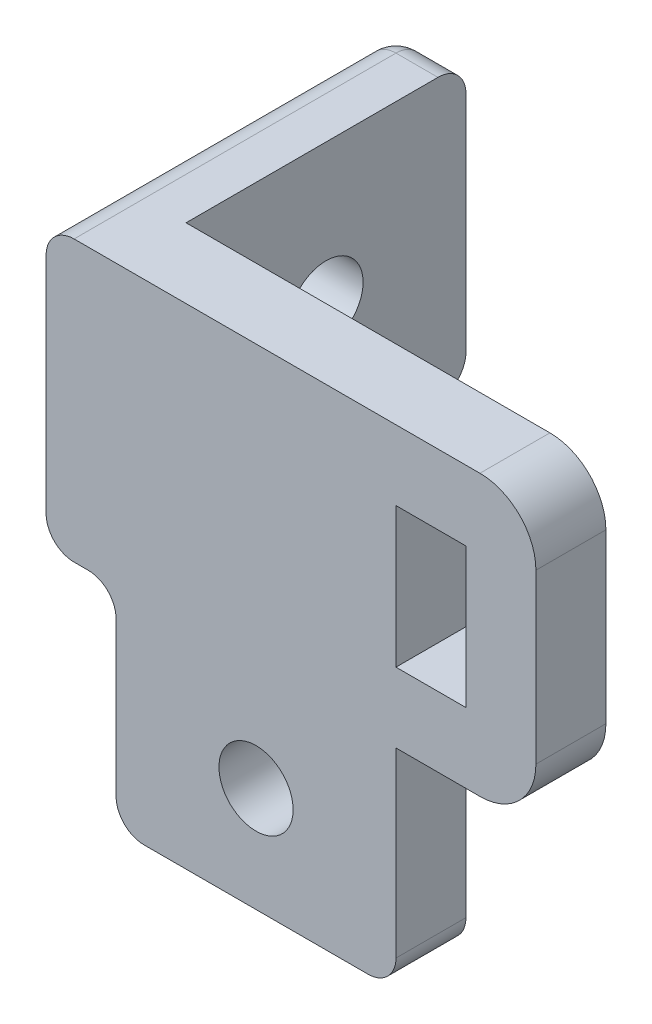
ISO-10303-21;
HEADER;
FILE_DESCRIPTION(('STEP AP214'),'2;1');
FILE_NAME('part.step','',(''),(''),'','','');
FILE_SCHEMA(('AUTOMOTIVE_DESIGN { 1 0 10303 214 1 1 1 1 }'));
ENDSEC;
DATA;
#1=APPLICATION_CONTEXT('core data for automotive mechanical design processes');
#2=APPLICATION_PROTOCOL_DEFINITION('international standard','automotive_design',2000,#1);
#3=PRODUCT_CONTEXT('',#1,'mechanical');
#4=PRODUCT('Part','Part','',(#3));
#5=PRODUCT_RELATED_PRODUCT_CATEGORY('part','',(#4));
#6=PRODUCT_DEFINITION_FORMATION('','',#4);
#7=PRODUCT_DEFINITION_CONTEXT('part definition',#1,'design');
#8=PRODUCT_DEFINITION('design','',#6,#7);
#9=PRODUCT_DEFINITION_SHAPE('','',#8);
#10=(LENGTH_UNIT() NAMED_UNIT(*) SI_UNIT(.MILLI.,.METRE.));
#11=(NAMED_UNIT(*) PLANE_ANGLE_UNIT() SI_UNIT($,.RADIAN.));
#12=(NAMED_UNIT(*) SI_UNIT($,.STERADIAN.) SOLID_ANGLE_UNIT());
#13=UNCERTAINTY_MEASURE_WITH_UNIT(LENGTH_MEASURE(1.E-05),#10,'distance_accuracy_value','');
#14=(GEOMETRIC_REPRESENTATION_CONTEXT(3) GLOBAL_UNCERTAINTY_ASSIGNED_CONTEXT((#13)) GLOBAL_UNIT_ASSIGNED_CONTEXT((#10,
#11,#12)) REPRESENTATION_CONTEXT('',''));
#15=CARTESIAN_POINT('',(0.,0.,0.));
#16=DIRECTION('',(0.,0.,1.));
#17=DIRECTION('',(1.,0.,0.));
#18=AXIS2_PLACEMENT_3D('',#15,#16,#17);
#19=CARTESIAN_POINT('',(-15.,-10.,5.));
#20=DIRECTION('',(0.,1.,0.));
#21=DIRECTION('',(0.,0.,1.));
#22=AXIS2_PLACEMENT_3D('',#19,#20,#21);
#23=PLANE('',#22);
#24=DIRECTION('',(1.,0.,0.));
#25=VECTOR('',#24,1.);
#26=CARTESIAN_POINT('',(-15.,-10.,5.));
#27=LINE('',#26,#25);
#28=CARTESIAN_POINT('',(4.99999999999999,-10.,5.));
#29=VERTEX_POINT('',#28);
#30=CARTESIAN_POINT('',(11.,-10.,5.));
#31=VERTEX_POINT('',#30);
#32=EDGE_CURVE('E256',#29,#31,#27,.T.);
#33=ORIENTED_EDGE('',*,*,#32,.F.);
#34=DIRECTION('',(0.,0.,1.));
#35=VECTOR('',#34,1.);
#36=CARTESIAN_POINT('',(5.,-10.,0.));
#37=LINE('',#36,#35);
#38=CARTESIAN_POINT('',(5.,-10.,0.));
#39=VERTEX_POINT('',#38);
#40=EDGE_CURVE('E233',#39,#29,#37,.T.);
#41=ORIENTED_EDGE('',*,*,#40,.F.);
#42=DIRECTION('',(1.,0.,0.));
#43=VECTOR('',#42,1.);
#44=CARTESIAN_POINT('',(-15.,-10.,0.));
#45=LINE('',#44,#43);
#46=CARTESIAN_POINT('',(11.,-10.,0.));
#47=VERTEX_POINT('',#46);
#48=EDGE_CURVE('E243',#39,#47,#45,.T.);
#49=ORIENTED_EDGE('',*,*,#48,.T.);
#50=DIRECTION('',(0.,0.,-1.));
#51=VECTOR('',#50,1.);
#52=CARTESIAN_POINT('',(11.,-10.,5.));
#53=LINE('',#52,#51);
#54=EDGE_CURVE('E367',#31,#47,#53,.T.);
#55=ORIENTED_EDGE('',*,*,#54,.F.);
#56=EDGE_LOOP('',(#33,#41,#49,#55));
#57=FACE_BOUND('',#56,.T.);
#58=ADVANCED_FACE('F70',(#57),#23,.F.);
#59=CARTESIAN_POINT('',(-18.,-10.,5.));
#60=VERTEX_POINT('',#59);
#61=CARTESIAN_POINT('',(-17.,-10.,5.));
#62=VERTEX_POINT('',#61);
#63=EDGE_CURVE('E348',#60,#62,#27,.T.);
#64=ORIENTED_EDGE('',*,*,#63,.F.);
#65=DIRECTION('',(0.,0.,1.));
#66=VECTOR('',#65,1.);
#67=CARTESIAN_POINT('',(-18.,-10.,-18.));
#68=LINE('',#67,#66);
#69=CARTESIAN_POINT('',(-18.,-10.,-18.));
#70=VERTEX_POINT('',#69);
#71=EDGE_CURVE('E455',#60,#70,#68,.F.);
#72=ORIENTED_EDGE('',*,*,#71,.T.);
#73=DIRECTION('',(1.,0.,0.));
#74=VECTOR('',#73,1.);
#75=CARTESIAN_POINT('',(-15.,-10.,-18.));
#76=LINE('',#75,#74);
#77=CARTESIAN_POINT('',(-15.,-10.,-18.));
#78=VERTEX_POINT('',#77);
#79=EDGE_CURVE('E436',#70,#78,#76,.T.);
#80=ORIENTED_EDGE('',*,*,#79,.T.);
#81=DIRECTION('',(0.,0.,1.));
#82=VECTOR('',#81,1.);
#83=CARTESIAN_POINT('',(-15.,-10.,-20.));
#84=LINE('',#83,#82);
#85=CARTESIAN_POINT('',(-15.,-10.,0.));
#86=VERTEX_POINT('',#85);
#87=EDGE_CURVE('E286',#78,#86,#84,.T.);
#88=ORIENTED_EDGE('',*,*,#87,.T.);
#89=DIRECTION('',(-1.,0.,0.));
#90=VECTOR('',#89,1.);
#91=CARTESIAN_POINT('',(11.,-10.,0.));
#92=LINE('',#91,#90);
#93=CARTESIAN_POINT('',(-17.,-10.,0.));
#94=VERTEX_POINT('',#93);
#95=EDGE_CURVE('E370',#86,#94,#92,.T.);
#96=ORIENTED_EDGE('',*,*,#95,.T.);
#97=DIRECTION('',(0.,0.,1.));
#98=VECTOR('',#97,1.);
#99=CARTESIAN_POINT('',(-17.,-10.,5.));
#100=LINE('',#99,#98);
#101=EDGE_CURVE('E383',#94,#62,#100,.T.);
#102=ORIENTED_EDGE('',*,*,#101,.T.);
#103=EDGE_LOOP('',(#64,#72,#80,#88,#96,#102));
#104=FACE_BOUND('',#103,.T.);
#105=ADVANCED_FACE('F530',(#104),#23,.F.);
#106=CARTESIAN_POINT('',(11.,-6.,5.));
#107=DIRECTION('',(0.,0.,-1.));
#108=DIRECTION('',(-1.,0.,0.));
#109=AXIS2_PLACEMENT_3D('',#106,#107,#108);
#110=CYLINDRICAL_SURFACE('',#109,4.);
#111=CARTESIAN_POINT('',(11.,-6.,0.));
#112=DIRECTION('',(0.,0.,-1.));
#113=DIRECTION('',(-1.,0.,0.));
#114=AXIS2_PLACEMENT_3D('',#111,#112,#113);
#115=CIRCLE('',#114,4.);
#116=CARTESIAN_POINT('',(15.,-6.,0.));
#117=VERTEX_POINT('',#116);
#118=EDGE_CURVE('E248',#117,#47,#115,.T.);
#119=ORIENTED_EDGE('',*,*,#118,.F.);
#120=DIRECTION('',(0.,0.,-1.));
#121=VECTOR('',#120,1.);
#122=CARTESIAN_POINT('',(15.,-6.,5.));
#123=LINE('',#122,#121);
#124=CARTESIAN_POINT('',(15.,-6.,5.));
#125=VERTEX_POINT('',#124);
#126=EDGE_CURVE('E371',#125,#117,#123,.T.);
#127=ORIENTED_EDGE('',*,*,#126,.F.);
#128=CARTESIAN_POINT('',(11.,-6.,5.));
#129=DIRECTION('',(0.,0.,-1.));
#130=DIRECTION('',(-1.,0.,0.));
#131=AXIS2_PLACEMENT_3D('',#128,#129,#130);
#132=CIRCLE('',#131,4.);
#133=EDGE_CURVE('E344',#125,#31,#132,.T.);
#134=ORIENTED_EDGE('',*,*,#133,.T.);
#135=ORIENTED_EDGE('',*,*,#54,.T.);
#136=EDGE_LOOP('',(#119,#127,#134,#135));
#137=FACE_BOUND('',#136,.T.);
#138=ADVANCED_FACE('F553',(#137),#110,.T.);
#139=CARTESIAN_POINT('',(15.,-6.,5.));
#140=DIRECTION('',(-1.,0.,0.));
#141=DIRECTION('',(0.,0.,1.));
#142=AXIS2_PLACEMENT_3D('',#139,#140,#141);
#143=PLANE('',#142);
#144=DIRECTION('',(0.,1.,0.));
#145=VECTOR('',#144,1.);
#146=CARTESIAN_POINT('',(15.,-6.,0.));
#147=LINE('',#146,#145);
#148=CARTESIAN_POINT('',(15.,6.,0.));
#149=VERTEX_POINT('',#148);
#150=EDGE_CURVE('E363',#117,#149,#147,.T.);
#151=ORIENTED_EDGE('',*,*,#150,.T.);
#152=DIRECTION('',(0.,0.,-1.));
#153=VECTOR('',#152,1.);
#154=CARTESIAN_POINT('',(15.,6.,5.));
#155=LINE('',#154,#153);
#156=CARTESIAN_POINT('',(15.,6.,5.));
#157=VERTEX_POINT('',#156);
#158=EDGE_CURVE('E374',#157,#149,#155,.T.);
#159=ORIENTED_EDGE('',*,*,#158,.F.);
#160=DIRECTION('',(0.,1.,0.));
#161=VECTOR('',#160,1.);
#162=CARTESIAN_POINT('',(15.,-6.,5.));
#163=LINE('',#162,#161);
#164=EDGE_CURVE('E341',#125,#157,#163,.T.);
#165=ORIENTED_EDGE('',*,*,#164,.F.);
#166=ORIENTED_EDGE('',*,*,#126,.T.);
#167=EDGE_LOOP('',(#151,#159,#165,#166));
#168=FACE_BOUND('',#167,.T.);
#169=ADVANCED_FACE('F550',(#168),#143,.F.);
#170=CARTESIAN_POINT('',(11.,6.,5.));
#171=DIRECTION('',(0.,0.,-1.));
#172=DIRECTION('',(-1.,0.,0.));
#173=AXIS2_PLACEMENT_3D('',#170,#171,#172);
#174=CYLINDRICAL_SURFACE('',#173,4.);
#175=CARTESIAN_POINT('',(11.,6.,0.));
#176=DIRECTION('',(0.,0.,1.));
#177=DIRECTION('',(1.,0.,0.));
#178=AXIS2_PLACEMENT_3D('',#175,#176,#177);
#179=CIRCLE('',#178,4.);
#180=CARTESIAN_POINT('',(11.,10.,0.));
#181=VERTEX_POINT('',#180);
#182=EDGE_CURVE('E359',#149,#181,#179,.T.);
#183=ORIENTED_EDGE('',*,*,#182,.T.);
#184=DIRECTION('',(0.,0.,-1.));
#185=VECTOR('',#184,1.);
#186=CARTESIAN_POINT('',(11.,10.,5.));
#187=LINE('',#186,#185);
#188=CARTESIAN_POINT('',(11.,10.,5.));
#189=VERTEX_POINT('',#188);
#190=EDGE_CURVE('E351',#189,#181,#187,.T.);
#191=ORIENTED_EDGE('',*,*,#190,.F.);
#192=CARTESIAN_POINT('',(11.,6.,5.));
#193=DIRECTION('',(0.,0.,1.));
#194=DIRECTION('',(1.,0.,0.));
#195=AXIS2_PLACEMENT_3D('',#192,#193,#194);
#196=CIRCLE('',#195,4.);
#197=EDGE_CURVE('E337',#157,#189,#196,.T.);
#198=ORIENTED_EDGE('',*,*,#197,.F.);
#199=ORIENTED_EDGE('',*,*,#158,.T.);
#200=EDGE_LOOP('',(#183,#191,#198,#199));
#201=FACE_BOUND('',#200,.T.);
#202=ADVANCED_FACE('F546',(#201),#174,.T.);
#203=CARTESIAN_POINT('',(-15.,10.,5.));
#204=DIRECTION('',(0.,1.,0.));
#205=DIRECTION('',(0.,0.,1.));
#206=AXIS2_PLACEMENT_3D('',#203,#204,#205);
#207=PLANE('',#206);
#208=DIRECTION('',(-1.,0.,0.));
#209=VECTOR('',#208,1.);
#210=CARTESIAN_POINT('',(-15.,10.,-18.));
#211=LINE('',#210,#209);
#212=CARTESIAN_POINT('',(-15.,10.,-18.));
#213=VERTEX_POINT('',#212);
#214=CARTESIAN_POINT('',(-18.,10.,-18.));
#215=VERTEX_POINT('',#214);
#216=EDGE_CURVE('E421',#213,#215,#211,.T.);
#217=ORIENTED_EDGE('',*,*,#216,.T.);
#218=DIRECTION('',(0.,0.,1.));
#219=VECTOR('',#218,1.);
#220=CARTESIAN_POINT('',(-18.,10.,5.));
#221=LINE('',#220,#219);
#222=CARTESIAN_POINT('',(-18.,10.,5.));
#223=VERTEX_POINT('',#222);
#224=EDGE_CURVE('E12',#215,#223,#221,.T.);
#225=ORIENTED_EDGE('',*,*,#224,.T.);
#226=DIRECTION('',(1.,0.,0.));
#227=VECTOR('',#226,1.);
#228=CARTESIAN_POINT('',(-15.,10.,5.));
#229=LINE('',#228,#227);
#230=EDGE_CURVE('E253',#223,#189,#229,.T.);
#231=ORIENTED_EDGE('',*,*,#230,.T.);
#232=ORIENTED_EDGE('',*,*,#190,.T.);
#233=DIRECTION('',(1.,0.,0.));
#234=VECTOR('',#233,1.);
#235=CARTESIAN_POINT('',(-15.,10.,0.));
#236=LINE('',#235,#234);
#237=CARTESIAN_POINT('',(-15.,10.,0.));
#238=VERTEX_POINT('',#237);
#239=EDGE_CURVE('E355',#238,#181,#236,.T.);
#240=ORIENTED_EDGE('',*,*,#239,.F.);
#241=DIRECTION('',(0.,0.,1.));
#242=VECTOR('',#241,1.);
#243=CARTESIAN_POINT('',(-15.,10.,-20.));
#244=LINE('',#243,#242);
#245=EDGE_CURVE('E282',#213,#238,#244,.T.);
#246=ORIENTED_EDGE('',*,*,#245,.F.);
#247=EDGE_LOOP('',(#217,#225,#231,#232,#240,#246));
#248=FACE_BOUND('',#247,.T.);
#249=ADVANCED_FACE('F541',(#248),#207,.T.);
#250=CARTESIAN_POINT('',(11.,6.,5.));
#251=DIRECTION('',(0.,0.,1.));
#252=DIRECTION('',(1.,0.,0.));
#253=AXIS2_PLACEMENT_3D('',#250,#251,#252);
#254=PLANE('',#253);
#255=DIRECTION('',(0.,-1.,0.));
#256=VECTOR('',#255,1.);
#257=CARTESIAN_POINT('',(9.99999999999999,0.,5.));
#258=LINE('',#257,#256);
#259=CARTESIAN_POINT('',(9.99999999999999,5.,5.));
#260=VERTEX_POINT('',#259);
#261=CARTESIAN_POINT('',(9.99999999999999,-5.,5.));
#262=VERTEX_POINT('',#261);
#263=EDGE_CURVE('E292',#260,#262,#258,.T.);
#264=ORIENTED_EDGE('',*,*,#263,.T.);
#265=DIRECTION('',(1.,0.,0.));
#266=VECTOR('',#265,1.);
#267=CARTESIAN_POINT('',(0.,-5.,5.));
#268=LINE('',#267,#266);
#269=CARTESIAN_POINT('',(4.99999999999999,-5.,5.));
#270=VERTEX_POINT('',#269);
#271=EDGE_CURVE('E305',#270,#262,#268,.T.);
#272=ORIENTED_EDGE('',*,*,#271,.F.);
#273=DIRECTION('',(0.,-1.,0.));
#274=VECTOR('',#273,1.);
#275=CARTESIAN_POINT('',(4.99999999999999,0.,5.));
#276=LINE('',#275,#274);
#277=CARTESIAN_POINT('',(4.99999999999999,5.,5.));
#278=VERTEX_POINT('',#277);
#279=EDGE_CURVE('E301',#278,#270,#276,.T.);
#280=ORIENTED_EDGE('',*,*,#279,.F.);
#281=DIRECTION('',(1.,0.,0.));
#282=VECTOR('',#281,1.);
#283=CARTESIAN_POINT('',(0.,5.,5.));
#284=LINE('',#283,#282);
#285=EDGE_CURVE('E296',#278,#260,#284,.T.);
#286=ORIENTED_EDGE('',*,*,#285,.T.);
#287=EDGE_LOOP('',(#264,#272,#280,#286));
#288=FACE_BOUND('',#287,.T.);
#289=DIRECTION('',(0.,-1.,0.));
#290=VECTOR('',#289,1.);
#291=CARTESIAN_POINT('',(-20.,10.,5.));
#292=LINE('',#291,#290);
#293=CARTESIAN_POINT('',(-20.,8.,5.));
#294=VERTEX_POINT('',#293);
#295=CARTESIAN_POINT('',(-20.,-8.,5.));
#296=VERTEX_POINT('',#295);
#297=EDGE_CURVE('E277',#294,#296,#292,.T.);
#298=ORIENTED_EDGE('',*,*,#297,.T.);
#299=CARTESIAN_POINT('',(-18.,-8.,5.));
#300=DIRECTION('',(0.,0.,1.));
#301=DIRECTION('',(1.,0.,0.));
#302=AXIS2_PLACEMENT_3D('',#299,#300,#301);
#303=CIRCLE('',#302,2.);
#304=EDGE_CURVE('E452',#296,#60,#303,.T.);
#305=ORIENTED_EDGE('',*,*,#304,.T.);
#306=ORIENTED_EDGE('',*,*,#63,.T.);
#307=CARTESIAN_POINT('',(-17.,-12.,5.));
#308=DIRECTION('',(0.,0.,1.));
#309=DIRECTION('',(1.,0.,0.));
#310=AXIS2_PLACEMENT_3D('',#307,#308,#309);
#311=CIRCLE('',#310,2.);
#312=CARTESIAN_POINT('',(-15.,-12.,5.));
#313=VERTEX_POINT('',#312);
#314=EDGE_CURVE('E390',#62,#313,#311,.F.);
#315=ORIENTED_EDGE('',*,*,#314,.T.);
#316=DIRECTION('',(0.,-1.,0.));
#317=VECTOR('',#316,1.);
#318=CARTESIAN_POINT('',(-15.,-10.,5.));
#319=LINE('',#318,#317);
#320=CARTESIAN_POINT('',(-15.,-23.,5.));
#321=VERTEX_POINT('',#320);
#322=EDGE_CURVE('E497',#313,#321,#319,.T.);
#323=ORIENTED_EDGE('',*,*,#322,.T.);
#324=CARTESIAN_POINT('',(-13.,-23.,5.));
#325=DIRECTION('',(0.,0.,1.));
#326=DIRECTION('',(1.,0.,0.));
#327=AXIS2_PLACEMENT_3D('',#324,#325,#326);
#328=CIRCLE('',#327,2.);
#329=CARTESIAN_POINT('',(-13.,-25.,5.));
#330=VERTEX_POINT('',#329);
#331=EDGE_CURVE('E403',#321,#330,#328,.T.);
#332=ORIENTED_EDGE('',*,*,#331,.T.);
#333=DIRECTION('',(1.,0.,0.));
#334=VECTOR('',#333,1.);
#335=CARTESIAN_POINT('',(-15.,-25.,5.));
#336=LINE('',#335,#334);
#337=CARTESIAN_POINT('',(3.,-25.,5.));
#338=VERTEX_POINT('',#337);
#339=EDGE_CURVE('E240',#330,#338,#336,.T.);
#340=ORIENTED_EDGE('',*,*,#339,.T.);
#341=CARTESIAN_POINT('',(3.,-23.,5.));
#342=DIRECTION('',(0.,0.,1.));
#343=DIRECTION('',(1.,0.,0.));
#344=AXIS2_PLACEMENT_3D('',#341,#342,#343);
#345=CIRCLE('',#344,2.);
#346=CARTESIAN_POINT('',(5.,-23.,5.));
#347=VERTEX_POINT('',#346);
#348=EDGE_CURVE('E406',#338,#347,#345,.T.);
#349=ORIENTED_EDGE('',*,*,#348,.T.);
#350=DIRECTION('',(0.,1.,0.));
#351=VECTOR('',#350,1.);
#352=CARTESIAN_POINT('',(5.,-10.,5.));
#353=LINE('',#352,#351);
#354=EDGE_CURVE('E490',#347,#29,#353,.T.);
#355=ORIENTED_EDGE('',*,*,#354,.T.);
#356=ORIENTED_EDGE('',*,*,#32,.T.);
#357=ORIENTED_EDGE('',*,*,#133,.F.);
#358=ORIENTED_EDGE('',*,*,#164,.T.);
#359=ORIENTED_EDGE('',*,*,#197,.T.);
#360=ORIENTED_EDGE('',*,*,#230,.F.);
#361=CARTESIAN_POINT('',(-18.,8.,5.));
#362=DIRECTION('',(0.,0.,1.));
#363=DIRECTION('',(1.,0.,0.));
#364=AXIS2_PLACEMENT_3D('',#361,#362,#363);
#365=CIRCLE('',#364,2.);
#366=EDGE_CURVE('E449',#223,#294,#365,.T.);
#367=ORIENTED_EDGE('',*,*,#366,.T.);
#368=EDGE_LOOP('',(#298,#305,#306,#315,#323,#332,#340,#349,#355,#356,#357,#358,#359,#360,#367));
#369=FACE_BOUND('',#368,.T.);
#370=CARTESIAN_POINT('',(-5.,-17.5,5.));
#371=DIRECTION('',(0.,0.,1.));
#372=DIRECTION('',(1.,0.,0.));
#373=AXIS2_PLACEMENT_3D('',#370,#371,#372);
#374=CIRCLE('',#373,2.65);
#375=CARTESIAN_POINT('',(-2.35,-17.5,5.));
#376=VERTEX_POINT('',#375);
#377=EDGE_CURVE('E479',#376,#376,#374,.T.);
#378=ORIENTED_EDGE('',*,*,#377,.F.);
#379=EDGE_LOOP('',(#378));
#380=FACE_BOUND('',#379,.T.);
#381=ADVANCED_FACE('F506',(#288,#369,#380),#254,.T.);
#382=CARTESIAN_POINT('',(11.,6.,0.));
#383=DIRECTION('',(0.,0.,1.));
#384=DIRECTION('',(1.,0.,0.));
#385=AXIS2_PLACEMENT_3D('',#382,#383,#384);
#386=PLANE('',#385);
#387=DIRECTION('',(1.,0.,0.));
#388=VECTOR('',#387,1.);
#389=CARTESIAN_POINT('',(0.,-5.,0.));
#390=LINE('',#389,#388);
#391=CARTESIAN_POINT('',(4.99999999999999,-5.,0.));
#392=VERTEX_POINT('',#391);
#393=CARTESIAN_POINT('',(9.99999999999999,-5.,0.));
#394=VERTEX_POINT('',#393);
#395=EDGE_CURVE('E297',#392,#394,#390,.T.);
#396=ORIENTED_EDGE('',*,*,#395,.T.);
#397=DIRECTION('',(0.,-1.,0.));
#398=VECTOR('',#397,1.);
#399=CARTESIAN_POINT('',(9.99999999999999,0.,0.));
#400=LINE('',#399,#398);
#401=CARTESIAN_POINT('',(9.99999999999999,5.,0.));
#402=VERTEX_POINT('',#401);
#403=EDGE_CURVE('E289',#402,#394,#400,.T.);
#404=ORIENTED_EDGE('',*,*,#403,.F.);
#405=DIRECTION('',(1.,0.,0.));
#406=VECTOR('',#405,1.);
#407=CARTESIAN_POINT('',(0.,5.,0.));
#408=LINE('',#407,#406);
#409=CARTESIAN_POINT('',(4.99999999999999,5.,0.));
#410=VERTEX_POINT('',#409);
#411=EDGE_CURVE('E311',#410,#402,#408,.T.);
#412=ORIENTED_EDGE('',*,*,#411,.F.);
#413=DIRECTION('',(0.,-1.,0.));
#414=VECTOR('',#413,1.);
#415=CARTESIAN_POINT('',(4.99999999999999,0.,0.));
#416=LINE('',#415,#414);
#417=EDGE_CURVE('E315',#410,#392,#416,.T.);
#418=ORIENTED_EDGE('',*,*,#417,.T.);
#419=EDGE_LOOP('',(#396,#404,#412,#418));
#420=FACE_BOUND('',#419,.T.);
#421=DIRECTION('',(0.,1.,0.));
#422=VECTOR('',#421,1.);
#423=CARTESIAN_POINT('',(5.,-10.,0.));
#424=LINE('',#423,#422);
#425=CARTESIAN_POINT('',(5.,-23.,0.));
#426=VERTEX_POINT('',#425);
#427=EDGE_CURVE('E228',#426,#39,#424,.T.);
#428=ORIENTED_EDGE('',*,*,#427,.F.);
#429=CARTESIAN_POINT('',(3.,-23.,0.));
#430=DIRECTION('',(0.,0.,1.));
#431=DIRECTION('',(1.,0.,0.));
#432=AXIS2_PLACEMENT_3D('',#429,#430,#431);
#433=CIRCLE('',#432,2.);
#434=CARTESIAN_POINT('',(3.,-25.,0.));
#435=VERTEX_POINT('',#434);
#436=EDGE_CURVE('E414',#426,#435,#433,.F.);
#437=ORIENTED_EDGE('',*,*,#436,.T.);
#438=DIRECTION('',(1.,0.,0.));
#439=VECTOR('',#438,1.);
#440=CARTESIAN_POINT('',(-15.,-25.,0.));
#441=LINE('',#440,#439);
#442=CARTESIAN_POINT('',(-13.,-25.,0.));
#443=VERTEX_POINT('',#442);
#444=EDGE_CURVE('E259',#443,#435,#441,.T.);
#445=ORIENTED_EDGE('',*,*,#444,.F.);
#446=CARTESIAN_POINT('',(-13.,-23.,0.));
#447=DIRECTION('',(0.,0.,1.));
#448=DIRECTION('',(1.,0.,0.));
#449=AXIS2_PLACEMENT_3D('',#446,#447,#448);
#450=CIRCLE('',#449,2.);
#451=CARTESIAN_POINT('',(-15.,-23.,0.));
#452=VERTEX_POINT('',#451);
#453=EDGE_CURVE('E411',#443,#452,#450,.F.);
#454=ORIENTED_EDGE('',*,*,#453,.T.);
#455=DIRECTION('',(0.,-1.,0.));
#456=VECTOR('',#455,1.);
#457=CARTESIAN_POINT('',(-15.,-10.,0.));
#458=LINE('',#457,#456);
#459=CARTESIAN_POINT('',(-15.,-12.,0.));
#460=VERTEX_POINT('',#459);
#461=EDGE_CURVE('E239',#460,#452,#458,.T.);
#462=ORIENTED_EDGE('',*,*,#461,.F.);
#463=CARTESIAN_POINT('',(-17.,-12.,0.));
#464=DIRECTION('',(0.,0.,1.));
#465=DIRECTION('',(1.,0.,0.));
#466=AXIS2_PLACEMENT_3D('',#463,#464,#465);
#467=CIRCLE('',#466,2.);
#468=EDGE_CURVE('E393',#460,#94,#467,.T.);
#469=ORIENTED_EDGE('',*,*,#468,.T.);
#470=ORIENTED_EDGE('',*,*,#95,.F.);
#471=DIRECTION('',(0.,1.,0.));
#472=VECTOR('',#471,1.);
#473=CARTESIAN_POINT('',(-15.,-10.,0.));
#474=LINE('',#473,#472);
#475=EDGE_CURVE('E334',#86,#238,#474,.T.);
#476=ORIENTED_EDGE('',*,*,#475,.T.);
#477=ORIENTED_EDGE('',*,*,#239,.T.);
#478=ORIENTED_EDGE('',*,*,#182,.F.);
#479=ORIENTED_EDGE('',*,*,#150,.F.);
#480=ORIENTED_EDGE('',*,*,#118,.T.);
#481=ORIENTED_EDGE('',*,*,#48,.F.);
#482=EDGE_LOOP('',(#428,#437,#445,#454,#462,#469,#470,#476,#477,#478,#479,#480,#481));
#483=FACE_BOUND('',#482,.T.);
#484=CARTESIAN_POINT('',(-5.,-17.5,0.));
#485=DIRECTION('',(0.,0.,1.));
#486=DIRECTION('',(1.,0.,0.));
#487=AXIS2_PLACEMENT_3D('',#484,#485,#486);
#488=CIRCLE('',#487,2.65);
#489=CARTESIAN_POINT('',(-2.35,-17.5,0.));
#490=VERTEX_POINT('',#489);
#491=EDGE_CURVE('E485',#490,#490,#488,.T.);
#492=ORIENTED_EDGE('',*,*,#491,.T.);
#493=EDGE_LOOP('',(#492));
#494=FACE_BOUND('',#493,.T.);
#495=ADVANCED_FACE('F244',(#420,#483,#494),#386,.F.);
#496=CARTESIAN_POINT('',(9.99999999999999,0.,5.));
#497=DIRECTION('',(1.,0.,0.));
#498=DIRECTION('',(0.,0.,-1.));
#499=AXIS2_PLACEMENT_3D('',#496,#497,#498);
#500=PLANE('',#499);
#501=ORIENTED_EDGE('',*,*,#403,.T.);
#502=DIRECTION('',(0.,0.,-1.));
#503=VECTOR('',#502,1.);
#504=CARTESIAN_POINT('',(9.99999999999999,-5.,5.));
#505=LINE('',#504,#503);
#506=EDGE_CURVE('E308',#262,#394,#505,.T.);
#507=ORIENTED_EDGE('',*,*,#506,.F.);
#508=ORIENTED_EDGE('',*,*,#263,.F.);
#509=DIRECTION('',(0.,0.,-1.));
#510=VECTOR('',#509,1.);
#511=CARTESIAN_POINT('',(9.99999999999999,5.,5.));
#512=LINE('',#511,#510);
#513=EDGE_CURVE('E331',#260,#402,#512,.T.);
#514=ORIENTED_EDGE('',*,*,#513,.T.);
#515=EDGE_LOOP('',(#501,#507,#508,#514));
#516=FACE_BOUND('',#515,.T.);
#517=ADVANCED_FACE('F599',(#516),#500,.F.);
#518=CARTESIAN_POINT('',(0.,5.,5.));
#519=DIRECTION('',(0.,1.,0.));
#520=DIRECTION('',(-1.,0.,0.));
#521=AXIS2_PLACEMENT_3D('',#518,#519,#520);
#522=PLANE('',#521);
#523=ORIENTED_EDGE('',*,*,#411,.T.);
#524=ORIENTED_EDGE('',*,*,#513,.F.);
#525=ORIENTED_EDGE('',*,*,#285,.F.);
#526=DIRECTION('',(0.,0.,-1.));
#527=VECTOR('',#526,1.);
#528=CARTESIAN_POINT('',(4.99999999999999,5.,5.));
#529=LINE('',#528,#527);
#530=EDGE_CURVE('E328',#278,#410,#529,.T.);
#531=ORIENTED_EDGE('',*,*,#530,.T.);
#532=EDGE_LOOP('',(#523,#524,#525,#531));
#533=FACE_BOUND('',#532,.T.);
#534=ADVANCED_FACE('F615',(#533),#522,.F.);
#535=CARTESIAN_POINT('',(4.99999999999999,0.,5.));
#536=DIRECTION('',(1.,0.,0.));
#537=DIRECTION('',(0.,1.,0.));
#538=AXIS2_PLACEMENT_3D('',#535,#536,#537);
#539=PLANE('',#538);
#540=ORIENTED_EDGE('',*,*,#417,.F.);
#541=ORIENTED_EDGE('',*,*,#530,.F.);
#542=ORIENTED_EDGE('',*,*,#279,.T.);
#543=DIRECTION('',(0.,0.,-1.));
#544=VECTOR('',#543,1.);
#545=CARTESIAN_POINT('',(4.99999999999999,-5.,5.));
#546=LINE('',#545,#544);
#547=EDGE_CURVE('E325',#270,#392,#546,.T.);
#548=ORIENTED_EDGE('',*,*,#547,.T.);
#549=EDGE_LOOP('',(#540,#541,#542,#548));
#550=FACE_BOUND('',#549,.T.);
#551=ADVANCED_FACE('F625',(#550),#539,.T.);
#552=CARTESIAN_POINT('',(0.,-5.,5.));
#553=DIRECTION('',(0.,1.,0.));
#554=DIRECTION('',(0.,0.,1.));
#555=AXIS2_PLACEMENT_3D('',#552,#553,#554);
#556=PLANE('',#555);
#557=ORIENTED_EDGE('',*,*,#395,.F.);
#558=ORIENTED_EDGE('',*,*,#547,.F.);
#559=ORIENTED_EDGE('',*,*,#271,.T.);
#560=ORIENTED_EDGE('',*,*,#506,.T.);
#561=EDGE_LOOP('',(#557,#558,#559,#560));
#562=FACE_BOUND('',#561,.T.);
#563=ADVANCED_FACE('F634',(#562),#556,.T.);
#564=CARTESIAN_POINT('',(-15.,10.,-20.));
#565=DIRECTION('',(1.,0.,0.));
#566=DIRECTION('',(0.,1.,0.));
#567=AXIS2_PLACEMENT_3D('',#564,#565,#566);
#568=PLANE('',#567);
#569=CARTESIAN_POINT('',(-15.,0.,-10.));
#570=DIRECTION('',(1.,0.,0.));
#571=DIRECTION('',(0.,1.,0.));
#572=AXIS2_PLACEMENT_3D('',#569,#570,#571);
#573=CIRCLE('',#572,2.65);
#574=CARTESIAN_POINT('',(-15.,2.65,-10.));
#575=VERTEX_POINT('',#574);
#576=EDGE_CURVE('E266',#575,#575,#573,.T.);
#577=ORIENTED_EDGE('',*,*,#576,.F.);
#578=EDGE_LOOP('',(#577));
#579=FACE_BOUND('',#578,.T.);
#580=DIRECTION('',(0.,1.,0.));
#581=VECTOR('',#580,1.);
#582=CARTESIAN_POINT('',(-15.,10.,-20.));
#583=LINE('',#582,#581);
#584=CARTESIAN_POINT('',(-15.,-8.,-20.));
#585=VERTEX_POINT('',#584);
#586=CARTESIAN_POINT('',(-15.,8.,-20.));
#587=VERTEX_POINT('',#586);
#588=EDGE_CURVE('E278',#585,#587,#583,.T.);
#589=ORIENTED_EDGE('',*,*,#588,.T.);
#590=CARTESIAN_POINT('',(-15.,8.,-18.));
#591=DIRECTION('',(1.,0.,0.));
#592=DIRECTION('',(0.,1.,0.));
#593=AXIS2_PLACEMENT_3D('',#590,#591,#592);
#594=CIRCLE('',#593,2.);
#595=EDGE_CURVE('E433',#587,#213,#594,.T.);
#596=ORIENTED_EDGE('',*,*,#595,.T.);
#597=ORIENTED_EDGE('',*,*,#245,.T.);
#598=ORIENTED_EDGE('',*,*,#475,.F.);
#599=ORIENTED_EDGE('',*,*,#87,.F.);
#600=CARTESIAN_POINT('',(-15.,-8.,-18.));
#601=DIRECTION('',(1.,0.,0.));
#602=DIRECTION('',(0.,1.,0.));
#603=AXIS2_PLACEMENT_3D('',#600,#601,#602);
#604=CIRCLE('',#603,2.);
#605=EDGE_CURVE('E430',#78,#585,#604,.T.);
#606=ORIENTED_EDGE('',*,*,#605,.T.);
#607=EDGE_LOOP('',(#589,#596,#597,#598,#599,#606));
#608=FACE_BOUND('',#607,.T.);
#609=ADVANCED_FACE('F535',(#579,#608),#568,.T.);
#610=CARTESIAN_POINT('',(-20.,10.,-20.));
#611=DIRECTION('',(-1.,0.,0.));
#612=DIRECTION('',(0.,-1.,0.));
#613=AXIS2_PLACEMENT_3D('',#610,#611,#612);
#614=PLANE('',#613);
#615=CARTESIAN_POINT('',(-20.,0.,-10.));
#616=DIRECTION('',(-1.,0.,0.));
#617=DIRECTION('',(0.,-1.,0.));
#618=AXIS2_PLACEMENT_3D('',#615,#616,#617);
#619=CIRCLE('',#618,2.65);
#620=CARTESIAN_POINT('',(-20.,-2.65,-10.));
#621=VERTEX_POINT('',#620);
#622=EDGE_CURVE('E258',#621,#621,#619,.T.);
#623=ORIENTED_EDGE('',*,*,#622,.F.);
#624=EDGE_LOOP('',(#623));
#625=FACE_BOUND('',#624,.T.);
#626=DIRECTION('',(0.,-1.,0.));
#627=VECTOR('',#626,1.);
#628=CARTESIAN_POINT('',(-20.,10.,-18.));
#629=LINE('',#628,#627);
#630=CARTESIAN_POINT('',(-20.,8.,-18.));
#631=VERTEX_POINT('',#630);
#632=CARTESIAN_POINT('',(-20.,-8.,-18.));
#633=VERTEX_POINT('',#632);
#634=EDGE_CURVE('E442',#631,#633,#629,.T.);
#635=ORIENTED_EDGE('',*,*,#634,.T.);
#636=DIRECTION('',(0.,0.,1.));
#637=VECTOR('',#636,1.);
#638=CARTESIAN_POINT('',(-20.,-8.,5.));
#639=LINE('',#638,#637);
#640=EDGE_CURVE('E445',#633,#296,#639,.T.);
#641=ORIENTED_EDGE('',*,*,#640,.T.);
#642=ORIENTED_EDGE('',*,*,#297,.F.);
#643=DIRECTION('',(0.,0.,1.));
#644=VECTOR('',#643,1.);
#645=CARTESIAN_POINT('',(-20.,8.,-20.));
#646=LINE('',#645,#644);
#647=EDGE_CURVE('E439',#294,#631,#646,.F.);
#648=ORIENTED_EDGE('',*,*,#647,.T.);
#649=EDGE_LOOP('',(#635,#641,#642,#648));
#650=FACE_BOUND('',#649,.T.);
#651=ADVANCED_FACE('F651',(#625,#650),#614,.T.);
#652=CARTESIAN_POINT('',(0.,0.,-20.));
#653=DIRECTION('',(0.,0.,-1.));
#654=DIRECTION('',(-1.,0.,0.));
#655=AXIS2_PLACEMENT_3D('',#652,#653,#654);
#656=PLANE('',#655);
#657=DIRECTION('',(1.,0.,0.));
#658=VECTOR('',#657,1.);
#659=CARTESIAN_POINT('',(-20.,-8.,-20.));
#660=LINE('',#659,#658);
#661=CARTESIAN_POINT('',(-18.,-8.,-20.));
#662=VERTEX_POINT('',#661);
#663=EDGE_CURVE('E424',#585,#662,#660,.F.);
#664=ORIENTED_EDGE('',*,*,#663,.T.);
#665=DIRECTION('',(0.,-1.,0.));
#666=VECTOR('',#665,1.);
#667=CARTESIAN_POINT('',(-18.,0.,-20.));
#668=LINE('',#667,#666);
#669=CARTESIAN_POINT('',(-18.,8.,-20.));
#670=VERTEX_POINT('',#669);
#671=EDGE_CURVE('E95',#662,#670,#668,.F.);
#672=ORIENTED_EDGE('',*,*,#671,.T.);
#673=DIRECTION('',(-1.,0.,0.));
#674=VECTOR('',#673,1.);
#675=CARTESIAN_POINT('',(0.,8.,-20.));
#676=LINE('',#675,#674);
#677=EDGE_CURVE('E427',#670,#587,#676,.F.);
#678=ORIENTED_EDGE('',*,*,#677,.T.);
#679=ORIENTED_EDGE('',*,*,#588,.F.);
#680=EDGE_LOOP('',(#664,#672,#678,#679));
#681=FACE_BOUND('',#680,.T.);
#682=ADVANCED_FACE('F660',(#681),#656,.T.);
#683=CARTESIAN_POINT('',(15.,0.,-10.));
#684=DIRECTION('',(-1.,0.,0.));
#685=DIRECTION('',(0.,-1.,0.));
#686=AXIS2_PLACEMENT_3D('',#683,#684,#685);
#687=CYLINDRICAL_SURFACE('',#686,2.65);
#688=ORIENTED_EDGE('',*,*,#576,.T.);
#689=EDGE_LOOP('',(#688));
#690=FACE_BOUND('',#689,.T.);
#691=ORIENTED_EDGE('',*,*,#622,.T.);
#692=EDGE_LOOP('',(#691));
#693=FACE_BOUND('',#692,.T.);
#694=ADVANCED_FACE('F670',(#690,#693),#687,.F.);
#695=CARTESIAN_POINT('',(5.,-10.,0.));
#696=DIRECTION('',(1.,0.,0.));
#697=DIRECTION('',(0.,1.,0.));
#698=AXIS2_PLACEMENT_3D('',#695,#696,#697);
#699=PLANE('',#698);
#700=ORIENTED_EDGE('',*,*,#354,.F.);
#701=DIRECTION('',(0.,0.,1.));
#702=VECTOR('',#701,1.);
#703=CARTESIAN_POINT('',(5.,-23.,0.));
#704=LINE('',#703,#702);
#705=EDGE_CURVE('E235',#347,#426,#704,.F.);
#706=ORIENTED_EDGE('',*,*,#705,.T.);
#707=ORIENTED_EDGE('',*,*,#427,.T.);
#708=ORIENTED_EDGE('',*,*,#40,.T.);
#709=EDGE_LOOP('',(#700,#706,#707,#708));
#710=FACE_BOUND('',#709,.T.);
#711=ADVANCED_FACE('F231',(#710),#699,.T.);
#712=CARTESIAN_POINT('',(-15.,-25.,0.));
#713=DIRECTION('',(0.,-1.,0.));
#714=DIRECTION('',(0.,0.,-1.));
#715=AXIS2_PLACEMENT_3D('',#712,#713,#714);
#716=PLANE('',#715);
#717=ORIENTED_EDGE('',*,*,#444,.T.);
#718=DIRECTION('',(0.,0.,1.));
#719=VECTOR('',#718,1.);
#720=CARTESIAN_POINT('',(3.,-25.,0.));
#721=LINE('',#720,#719);
#722=EDGE_CURVE('E399',#435,#338,#721,.T.);
#723=ORIENTED_EDGE('',*,*,#722,.T.);
#724=ORIENTED_EDGE('',*,*,#339,.F.);
#725=DIRECTION('',(0.,0.,1.));
#726=VECTOR('',#725,1.);
#727=CARTESIAN_POINT('',(-13.,-25.,0.));
#728=LINE('',#727,#726);
#729=EDGE_CURVE('E396',#330,#443,#728,.F.);
#730=ORIENTED_EDGE('',*,*,#729,.T.);
#731=EDGE_LOOP('',(#717,#723,#724,#730));
#732=FACE_BOUND('',#731,.T.);
#733=ADVANCED_FACE('F510',(#732),#716,.T.);
#734=CARTESIAN_POINT('',(-15.,-10.,0.));
#735=DIRECTION('',(-1.,0.,0.));
#736=DIRECTION('',(0.,-1.,0.));
#737=AXIS2_PLACEMENT_3D('',#734,#735,#736);
#738=PLANE('',#737);
#739=ORIENTED_EDGE('',*,*,#461,.T.);
#740=DIRECTION('',(0.,0.,1.));
#741=VECTOR('',#740,1.);
#742=CARTESIAN_POINT('',(-15.,-23.,0.));
#743=LINE('',#742,#741);
#744=EDGE_CURVE('E417',#452,#321,#743,.T.);
#745=ORIENTED_EDGE('',*,*,#744,.T.);
#746=ORIENTED_EDGE('',*,*,#322,.F.);
#747=DIRECTION('',(0.,0.,1.));
#748=VECTOR('',#747,1.);
#749=CARTESIAN_POINT('',(-15.,-12.,0.));
#750=LINE('',#749,#748);
#751=EDGE_CURVE('E387',#313,#460,#750,.F.);
#752=ORIENTED_EDGE('',*,*,#751,.T.);
#753=EDGE_LOOP('',(#739,#745,#746,#752));
#754=FACE_BOUND('',#753,.T.);
#755=ADVANCED_FACE('F520',(#754),#738,.T.);
#756=CARTESIAN_POINT('',(-5.,-17.5,0.));
#757=DIRECTION('',(0.,0.,1.));
#758=DIRECTION('',(1.,0.,0.));
#759=AXIS2_PLACEMENT_3D('',#756,#757,#758);
#760=CYLINDRICAL_SURFACE('',#759,2.65);
#761=ORIENTED_EDGE('',*,*,#491,.F.);
#762=EDGE_LOOP('',(#761));
#763=FACE_BOUND('',#762,.T.);
#764=ORIENTED_EDGE('',*,*,#377,.T.);
#765=EDGE_LOOP('',(#764));
#766=FACE_BOUND('',#765,.T.);
#767=ADVANCED_FACE('F700',(#763,#766),#760,.F.);
#768=CARTESIAN_POINT('',(-17.,-12.,5.));
#769=DIRECTION('',(0.,0.,1.));
#770=DIRECTION('',(1.,0.,0.));
#771=AXIS2_PLACEMENT_3D('',#768,#769,#770);
#772=CYLINDRICAL_SURFACE('',#771,2.);
#773=ORIENTED_EDGE('',*,*,#468,.F.);
#774=ORIENTED_EDGE('',*,*,#751,.F.);
#775=ORIENTED_EDGE('',*,*,#314,.F.);
#776=ORIENTED_EDGE('',*,*,#101,.F.);
#777=EDGE_LOOP('',(#773,#774,#775,#776));
#778=FACE_BOUND('',#777,.T.);
#779=ADVANCED_FACE('F524',(#778),#772,.F.);
#780=CARTESIAN_POINT('',(3.,-23.,0.));
#781=DIRECTION('',(0.,0.,1.));
#782=DIRECTION('',(1.,0.,0.));
#783=AXIS2_PLACEMENT_3D('',#780,#781,#782);
#784=CYLINDRICAL_SURFACE('',#783,2.);
#785=ORIENTED_EDGE('',*,*,#436,.F.);
#786=ORIENTED_EDGE('',*,*,#705,.F.);
#787=ORIENTED_EDGE('',*,*,#348,.F.);
#788=ORIENTED_EDGE('',*,*,#722,.F.);
#789=EDGE_LOOP('',(#785,#786,#787,#788));
#790=FACE_BOUND('',#789,.T.);
#791=ADVANCED_FACE('F716',(#790),#784,.T.);
#792=CARTESIAN_POINT('',(-13.,-23.,0.));
#793=DIRECTION('',(0.,0.,1.));
#794=DIRECTION('',(1.,0.,0.));
#795=AXIS2_PLACEMENT_3D('',#792,#793,#794);
#796=CYLINDRICAL_SURFACE('',#795,2.);
#797=ORIENTED_EDGE('',*,*,#453,.F.);
#798=ORIENTED_EDGE('',*,*,#729,.F.);
#799=ORIENTED_EDGE('',*,*,#331,.F.);
#800=ORIENTED_EDGE('',*,*,#744,.F.);
#801=EDGE_LOOP('',(#797,#798,#799,#800));
#802=FACE_BOUND('',#801,.T.);
#803=ADVANCED_FACE('F515',(#802),#796,.T.);
#804=CARTESIAN_POINT('',(-15.,8.,-18.));
#805=DIRECTION('',(-1.,0.,0.));
#806=DIRECTION('',(0.,0.,1.));
#807=AXIS2_PLACEMENT_3D('',#804,#805,#806);
#808=CYLINDRICAL_SURFACE('',#807,2.);
#809=ORIENTED_EDGE('',*,*,#677,.F.);
#810=CARTESIAN_POINT('',(-18.,8.,-18.));
#811=DIRECTION('',(-1.,0.,0.));
#812=DIRECTION('',(0.,0.,1.));
#813=AXIS2_PLACEMENT_3D('',#810,#811,#812);
#814=CIRCLE('',#813,2.);
#815=EDGE_CURVE('E80',#670,#215,#814,.F.);
#816=ORIENTED_EDGE('',*,*,#815,.T.);
#817=ORIENTED_EDGE('',*,*,#216,.F.);
#818=ORIENTED_EDGE('',*,*,#595,.F.);
#819=EDGE_LOOP('',(#809,#816,#817,#818));
#820=FACE_BOUND('',#819,.T.);
#821=ADVANCED_FACE('F731',(#820),#808,.T.);
#822=CARTESIAN_POINT('',(-15.,-8.,-18.));
#823=DIRECTION('',(-1.,0.,0.));
#824=DIRECTION('',(0.,0.,1.));
#825=AXIS2_PLACEMENT_3D('',#822,#823,#824);
#826=CYLINDRICAL_SURFACE('',#825,2.);
#827=ORIENTED_EDGE('',*,*,#79,.F.);
#828=CARTESIAN_POINT('',(-18.,-8.,-18.));
#829=DIRECTION('',(-1.,0.,0.));
#830=DIRECTION('',(0.,0.,1.));
#831=AXIS2_PLACEMENT_3D('',#828,#829,#830);
#832=CIRCLE('',#831,2.);
#833=EDGE_CURVE('E458',#70,#662,#832,.F.);
#834=ORIENTED_EDGE('',*,*,#833,.T.);
#835=ORIENTED_EDGE('',*,*,#663,.F.);
#836=ORIENTED_EDGE('',*,*,#605,.F.);
#837=EDGE_LOOP('',(#827,#834,#835,#836));
#838=FACE_BOUND('',#837,.T.);
#839=ADVANCED_FACE('F738',(#838),#826,.T.);
#840=CARTESIAN_POINT('',(-18.,8.,5.));
#841=DIRECTION('',(0.,0.,1.));
#842=DIRECTION('',(1.,0.,0.));
#843=AXIS2_PLACEMENT_3D('',#840,#841,#842);
#844=CYLINDRICAL_SURFACE('',#843,2.);
#845=ORIENTED_EDGE('',*,*,#366,.F.);
#846=ORIENTED_EDGE('',*,*,#224,.F.);
#847=CARTESIAN_POINT('',(-18.,8.,-18.));
#848=DIRECTION('',(0.,0.,-1.));
#849=DIRECTION('',(-1.,0.,0.));
#850=AXIS2_PLACEMENT_3D('',#847,#848,#849);
#851=CIRCLE('',#850,2.);
#852=EDGE_CURVE('E74',#631,#215,#851,.T.);
#853=ORIENTED_EDGE('',*,*,#852,.F.);
#854=ORIENTED_EDGE('',*,*,#647,.F.);
#855=EDGE_LOOP('',(#845,#846,#853,#854));
#856=FACE_BOUND('',#855,.T.);
#857=ADVANCED_FACE('F72',(#856),#844,.T.);
#858=CARTESIAN_POINT('',(-18.,8.,-18.));
#859=DIRECTION('',(-1.,0.,0.));
#860=DIRECTION('',(0.,-1.,0.));
#861=AXIS2_PLACEMENT_3D('',#858,#859,#860);
#862=SPHERICAL_SURFACE('',#861,2.);
#863=ORIENTED_EDGE('',*,*,#852,.T.);
#864=ORIENTED_EDGE('',*,*,#815,.F.);
#865=CARTESIAN_POINT('',(-18.,8.,-18.));
#866=DIRECTION('',(0.,-1.,0.));
#867=DIRECTION('',(0.,0.,-1.));
#868=AXIS2_PLACEMENT_3D('',#865,#866,#867);
#869=CIRCLE('',#868,2.);
#870=EDGE_CURVE('E471',#631,#670,#869,.T.);
#871=ORIENTED_EDGE('',*,*,#870,.F.);
#872=EDGE_LOOP('',(#863,#864,#871));
#873=FACE_BOUND('',#872,.T.);
#874=ADVANCED_FACE('F754',(#873),#862,.T.);
#875=CARTESIAN_POINT('',(-18.,10.,-18.));
#876=DIRECTION('',(0.,-1.,0.));
#877=DIRECTION('',(1.,0.,0.));
#878=AXIS2_PLACEMENT_3D('',#875,#876,#877);
#879=CYLINDRICAL_SURFACE('',#878,2.);
#880=ORIENTED_EDGE('',*,*,#870,.T.);
#881=ORIENTED_EDGE('',*,*,#671,.F.);
#882=CARTESIAN_POINT('',(-18.,-8.,-18.));
#883=DIRECTION('',(0.,-1.,0.));
#884=DIRECTION('',(0.,0.,-1.));
#885=AXIS2_PLACEMENT_3D('',#882,#883,#884);
#886=CIRCLE('',#885,2.);
#887=EDGE_CURVE('E468',#633,#662,#886,.T.);
#888=ORIENTED_EDGE('',*,*,#887,.F.);
#889=ORIENTED_EDGE('',*,*,#634,.F.);
#890=EDGE_LOOP('',(#880,#881,#888,#889));
#891=FACE_BOUND('',#890,.T.);
#892=ADVANCED_FACE('F762',(#891),#879,.T.);
#893=CARTESIAN_POINT('',(-18.,-8.,-18.));
#894=DIRECTION('',(-1.,0.,0.));
#895=DIRECTION('',(0.,-1.,0.));
#896=AXIS2_PLACEMENT_3D('',#893,#894,#895);
#897=SPHERICAL_SURFACE('',#896,2.);
#898=ORIENTED_EDGE('',*,*,#887,.T.);
#899=ORIENTED_EDGE('',*,*,#833,.F.);
#900=CARTESIAN_POINT('',(-18.,-8.,-18.));
#901=DIRECTION('',(0.,0.,1.));
#902=DIRECTION('',(1.,0.,0.));
#903=AXIS2_PLACEMENT_3D('',#900,#901,#902);
#904=CIRCLE('',#903,2.);
#905=EDGE_CURVE('E464',#633,#70,#904,.T.);
#906=ORIENTED_EDGE('',*,*,#905,.F.);
#907=EDGE_LOOP('',(#898,#899,#906));
#908=FACE_BOUND('',#907,.T.);
#909=ADVANCED_FACE('F769',(#908),#897,.T.);
#910=CARTESIAN_POINT('',(-18.,-8.,-20.));
#911=DIRECTION('',(0.,0.,-1.));
#912=DIRECTION('',(-1.,0.,0.));
#913=AXIS2_PLACEMENT_3D('',#910,#911,#912);
#914=CYLINDRICAL_SURFACE('',#913,2.);
#915=ORIENTED_EDGE('',*,*,#905,.T.);
#916=ORIENTED_EDGE('',*,*,#71,.F.);
#917=ORIENTED_EDGE('',*,*,#304,.F.);
#918=ORIENTED_EDGE('',*,*,#640,.F.);
#919=EDGE_LOOP('',(#915,#916,#917,#918));
#920=FACE_BOUND('',#919,.T.);
#921=ADVANCED_FACE('F777',(#920),#914,.T.);
#922=CLOSED_SHELL('',(#58,#105,#138,#169,#202,#249,#381,#495,#517,#534,#551,#563,#609,#651,#682,
#694,#711,#733,#755,#767,#779,#791,#803,#821,#839,#857,#874,#892,#909,#921));
#923=MANIFOLD_SOLID_BREP('B2',#922);
#924=ADVANCED_BREP_SHAPE_REPRESENTATION('',(#18,#923),#14);
#925=SHAPE_DEFINITION_REPRESENTATION(#9,#924);
ENDSEC;
END-ISO-10303-21;
